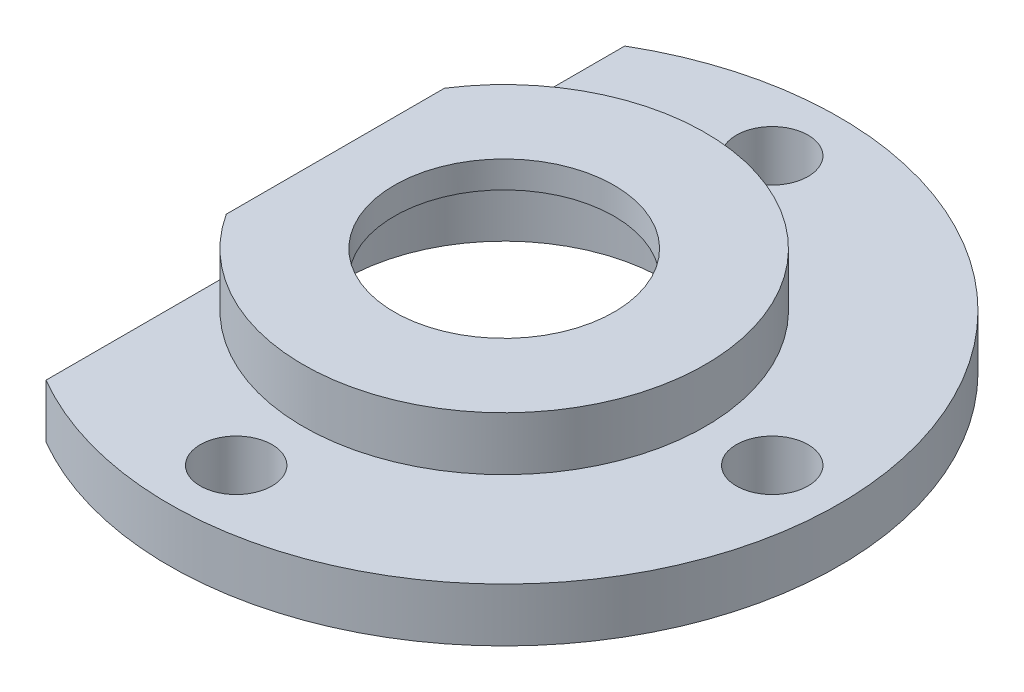
ISO-10303-21;
HEADER;
FILE_DESCRIPTION(('STEP AP214'),'2;1');
FILE_NAME('part.step','',(''),(''),'','','');
FILE_SCHEMA(('AUTOMOTIVE_DESIGN { 1 0 10303 214 1 1 1 1 }'));
ENDSEC;
DATA;
#1=APPLICATION_CONTEXT('core data for automotive mechanical design processes');
#2=APPLICATION_PROTOCOL_DEFINITION('international standard','automotive_design',2000,#1);
#3=PRODUCT_CONTEXT('',#1,'mechanical');
#4=PRODUCT('Part','Part','',(#3));
#5=PRODUCT_RELATED_PRODUCT_CATEGORY('part','',(#4));
#6=PRODUCT_DEFINITION_FORMATION('','',#4);
#7=PRODUCT_DEFINITION_CONTEXT('part definition',#1,'design');
#8=PRODUCT_DEFINITION('design','',#6,#7);
#9=PRODUCT_DEFINITION_SHAPE('','',#8);
#10=(LENGTH_UNIT() NAMED_UNIT(*) SI_UNIT(.MILLI.,.METRE.));
#11=(NAMED_UNIT(*) PLANE_ANGLE_UNIT() SI_UNIT($,.RADIAN.));
#12=(NAMED_UNIT(*) SI_UNIT($,.STERADIAN.) SOLID_ANGLE_UNIT());
#13=UNCERTAINTY_MEASURE_WITH_UNIT(LENGTH_MEASURE(1.E-05),#10,'distance_accuracy_value','');
#14=(GEOMETRIC_REPRESENTATION_CONTEXT(3) GLOBAL_UNCERTAINTY_ASSIGNED_CONTEXT((#13)) GLOBAL_UNIT_ASSIGNED_CONTEXT((#10,
#11,#12)) REPRESENTATION_CONTEXT('',''));
#15=CARTESIAN_POINT('',(0.,0.,0.));
#16=DIRECTION('',(0.,0.,1.));
#17=DIRECTION('',(1.,0.,0.));
#18=AXIS2_PLACEMENT_3D('',#15,#16,#17);
#19=CARTESIAN_POINT('',(0.,2.54,0.));
#20=DIRECTION('',(0.,-1.,0.));
#21=DIRECTION('',(0.,0.,1.));
#22=AXIS2_PLACEMENT_3D('',#19,#20,#21);
#23=CYLINDRICAL_SURFACE('',#22,15.875);
#24=DIRECTION('',(0.,-1.,0.));
#25=VECTOR('',#24,1.);
#26=CARTESIAN_POINT('',(-8.,5.33400000000001,13.7118789740867));
#27=LINE('',#26,#25);
#28=CARTESIAN_POINT('',(-8.,2.54,13.7118789740867));
#29=VERTEX_POINT('',#28);
#30=CARTESIAN_POINT('',(-8.,0.,13.7118789740867));
#31=VERTEX_POINT('',#30);
#32=EDGE_CURVE('E83',#29,#31,#27,.T.);
#33=ORIENTED_EDGE('',*,*,#32,.T.);
#34=CARTESIAN_POINT('',(0.,0.,0.));
#35=DIRECTION('',(0.,-1.,0.));
#36=DIRECTION('',(0.,0.,-1.));
#37=AXIS2_PLACEMENT_3D('',#34,#35,#36);
#38=CIRCLE('',#37,15.875);
#39=CARTESIAN_POINT('',(-8.,0.,-13.7118789740867));
#40=VERTEX_POINT('',#39);
#41=EDGE_CURVE('E89',#40,#31,#38,.T.);
#42=ORIENTED_EDGE('',*,*,#41,.F.);
#43=DIRECTION('',(0.,-1.,0.));
#44=VECTOR('',#43,1.);
#45=CARTESIAN_POINT('',(-8.,5.33400000000001,-13.7118789740867));
#46=LINE('',#45,#44);
#47=CARTESIAN_POINT('',(-8.,2.54,-13.7118789740867));
#48=VERTEX_POINT('',#47);
#49=EDGE_CURVE('E85',#48,#40,#46,.T.);
#50=ORIENTED_EDGE('',*,*,#49,.F.);
#51=CARTESIAN_POINT('',(0.,2.54,0.));
#52=DIRECTION('',(0.,-1.,0.));
#53=DIRECTION('',(0.,0.,-1.));
#54=AXIS2_PLACEMENT_3D('',#51,#52,#53);
#55=CIRCLE('',#54,15.875);
#56=EDGE_CURVE('E92',#48,#29,#55,.T.);
#57=ORIENTED_EDGE('',*,*,#56,.T.);
#58=EDGE_LOOP('',(#33,#42,#50,#57));
#59=FACE_BOUND('',#58,.T.);
#60=ADVANCED_FACE('F41',(#59),#23,.T.);
#61=CARTESIAN_POINT('',(0.,2.54,0.));
#62=DIRECTION('',(0.,1.,0.));
#63=DIRECTION('',(0.,0.,-1.));
#64=AXIS2_PLACEMENT_3D('',#61,#62,#63);
#65=PLANE('',#64);
#66=CARTESIAN_POINT('',(0.,2.54,-12.7));
#67=DIRECTION('',(0.,-1.,0.));
#68=DIRECTION('',(0.,0.,-1.));
#69=AXIS2_PLACEMENT_3D('',#66,#67,#68);
#70=CIRCLE('',#69,1.7);
#71=CARTESIAN_POINT('',(0.,2.54,-14.4));
#72=VERTEX_POINT('',#71);
#73=EDGE_CURVE('E117',#72,#72,#70,.T.);
#74=ORIENTED_EDGE('',*,*,#73,.T.);
#75=EDGE_LOOP('',(#74));
#76=FACE_BOUND('',#75,.T.);
#77=CARTESIAN_POINT('',(12.7,2.54,0.));
#78=DIRECTION('',(0.,-1.,0.));
#79=DIRECTION('',(0.,0.,-1.));
#80=AXIS2_PLACEMENT_3D('',#77,#78,#79);
#81=CIRCLE('',#80,1.70000000000004);
#82=CARTESIAN_POINT('',(12.7,2.54,-1.70000000000004));
#83=VERTEX_POINT('',#82);
#84=EDGE_CURVE('E110',#83,#83,#81,.T.);
#85=ORIENTED_EDGE('',*,*,#84,.T.);
#86=EDGE_LOOP('',(#85));
#87=FACE_BOUND('',#86,.T.);
#88=CARTESIAN_POINT('',(0.,2.54,12.7));
#89=DIRECTION('',(0.,-1.,0.));
#90=DIRECTION('',(0.,0.,-1.));
#91=AXIS2_PLACEMENT_3D('',#88,#89,#90);
#92=CIRCLE('',#91,1.7);
#93=CARTESIAN_POINT('',(0.,2.54,11.));
#94=VERTEX_POINT('',#93);
#95=EDGE_CURVE('E106',#94,#94,#92,.T.);
#96=ORIENTED_EDGE('',*,*,#95,.T.);
#97=EDGE_LOOP('',(#96));
#98=FACE_BOUND('',#97,.T.);
#99=ORIENTED_EDGE('',*,*,#56,.F.);
#100=DIRECTION('',(0.,0.,-1.));
#101=VECTOR('',#100,1.);
#102=CARTESIAN_POINT('',(-8.,2.54,0.));
#103=LINE('',#102,#101);
#104=CARTESIAN_POINT('',(-8.,2.54,-5.16968325915621));
#105=VERTEX_POINT('',#104);
#106=EDGE_CURVE('E103',#105,#48,#103,.T.);
#107=ORIENTED_EDGE('',*,*,#106,.F.);
#108=CARTESIAN_POINT('',(0.,2.54,0.));
#109=DIRECTION('',(0.,-1.,0.));
#110=DIRECTION('',(0.,0.,-1.));
#111=AXIS2_PLACEMENT_3D('',#108,#109,#110);
#112=CIRCLE('',#111,9.525);
#113=CARTESIAN_POINT('',(-8.,2.54,5.16968325915621));
#114=VERTEX_POINT('',#113);
#115=EDGE_CURVE('E48',#105,#114,#112,.T.);
#116=ORIENTED_EDGE('',*,*,#115,.T.);
#117=EDGE_CURVE('E105',#29,#114,#103,.T.);
#118=ORIENTED_EDGE('',*,*,#117,.F.);
#119=EDGE_LOOP('',(#99,#107,#116,#118));
#120=FACE_BOUND('',#119,.T.);
#121=ADVANCED_FACE('F141',(#76,#87,#98,#120),#65,.T.);
#122=CARTESIAN_POINT('',(0.,0.,0.));
#123=DIRECTION('',(0.,1.,0.));
#124=DIRECTION('',(0.,0.,-1.));
#125=AXIS2_PLACEMENT_3D('',#122,#123,#124);
#126=PLANE('',#125);
#127=CARTESIAN_POINT('',(0.,0.,0.));
#128=DIRECTION('',(0.,1.,0.));
#129=DIRECTION('',(0.,0.,1.));
#130=AXIS2_PLACEMENT_3D('',#127,#128,#129);
#131=CIRCLE('',#130,7.62);
#132=CARTESIAN_POINT('',(0.,0.,7.62));
#133=VERTEX_POINT('',#132);
#134=EDGE_CURVE('E128',#133,#133,#131,.T.);
#135=ORIENTED_EDGE('',*,*,#134,.T.);
#136=EDGE_LOOP('',(#135));
#137=FACE_BOUND('',#136,.T.);
#138=CARTESIAN_POINT('',(0.,0.,-12.7));
#139=DIRECTION('',(0.,-1.,0.));
#140=DIRECTION('',(0.,0.,-1.));
#141=AXIS2_PLACEMENT_3D('',#138,#139,#140);
#142=CIRCLE('',#141,1.7);
#143=CARTESIAN_POINT('',(0.,0.,-14.4));
#144=VERTEX_POINT('',#143);
#145=EDGE_CURVE('E120',#144,#144,#142,.F.);
#146=ORIENTED_EDGE('',*,*,#145,.T.);
#147=EDGE_LOOP('',(#146));
#148=FACE_BOUND('',#147,.T.);
#149=CARTESIAN_POINT('',(12.7,0.,0.));
#150=DIRECTION('',(0.,-1.,0.));
#151=DIRECTION('',(0.,0.,-1.));
#152=AXIS2_PLACEMENT_3D('',#149,#150,#151);
#153=CIRCLE('',#152,1.70000000000004);
#154=CARTESIAN_POINT('',(12.7,0.,-1.70000000000004));
#155=VERTEX_POINT('',#154);
#156=EDGE_CURVE('E114',#155,#155,#153,.F.);
#157=ORIENTED_EDGE('',*,*,#156,.T.);
#158=EDGE_LOOP('',(#157));
#159=FACE_BOUND('',#158,.T.);
#160=CARTESIAN_POINT('',(0.,0.,12.7));
#161=DIRECTION('',(0.,-1.,0.));
#162=DIRECTION('',(0.,0.,-1.));
#163=AXIS2_PLACEMENT_3D('',#160,#161,#162);
#164=CIRCLE('',#163,1.7);
#165=CARTESIAN_POINT('',(0.,0.,11.));
#166=VERTEX_POINT('',#165);
#167=EDGE_CURVE('E109',#166,#166,#164,.F.);
#168=ORIENTED_EDGE('',*,*,#167,.T.);
#169=EDGE_LOOP('',(#168));
#170=FACE_BOUND('',#169,.T.);
#171=DIRECTION('',(0.,0.,-1.));
#172=VECTOR('',#171,1.);
#173=CARTESIAN_POINT('',(-8.,0.,0.));
#174=LINE('',#173,#172);
#175=EDGE_CURVE('E79',#31,#40,#174,.T.);
#176=ORIENTED_EDGE('',*,*,#175,.T.);
#177=ORIENTED_EDGE('',*,*,#41,.T.);
#178=EDGE_LOOP('',(#176,#177));
#179=FACE_BOUND('',#178,.T.);
#180=ADVANCED_FACE('F90',(#137,#148,#159,#170,#179),#126,.F.);
#181=CARTESIAN_POINT('',(0.,5.08,0.));
#182=DIRECTION('',(0.,-1.,0.));
#183=DIRECTION('',(0.,0.,1.));
#184=AXIS2_PLACEMENT_3D('',#181,#182,#183);
#185=CYLINDRICAL_SURFACE('',#184,9.525);
#186=DIRECTION('',(0.,-1.,0.));
#187=VECTOR('',#186,1.);
#188=CARTESIAN_POINT('',(-8.,5.08,5.16968325915621));
#189=LINE('',#188,#187);
#190=CARTESIAN_POINT('',(-8.,5.08,5.16968325915621));
#191=VERTEX_POINT('',#190);
#192=EDGE_CURVE('E60',#191,#114,#189,.T.);
#193=ORIENTED_EDGE('',*,*,#192,.T.);
#194=ORIENTED_EDGE('',*,*,#115,.F.);
#195=DIRECTION('',(0.,-1.,0.));
#196=VECTOR('',#195,1.);
#197=CARTESIAN_POINT('',(-8.,5.08,-5.16968325915621));
#198=LINE('',#197,#196);
#199=CARTESIAN_POINT('',(-8.,5.08,-5.16968325915621));
#200=VERTEX_POINT('',#199);
#201=EDGE_CURVE('E96',#105,#200,#198,.F.);
#202=ORIENTED_EDGE('',*,*,#201,.T.);
#203=CARTESIAN_POINT('',(0.,5.08,0.));
#204=DIRECTION('',(0.,-1.,0.));
#205=DIRECTION('',(0.,0.,-1.));
#206=AXIS2_PLACEMENT_3D('',#203,#204,#205);
#207=CIRCLE('',#206,9.525);
#208=EDGE_CURVE('E93',#200,#191,#207,.T.);
#209=ORIENTED_EDGE('',*,*,#208,.T.);
#210=EDGE_LOOP('',(#193,#194,#202,#209));
#211=FACE_BOUND('',#210,.T.);
#212=ADVANCED_FACE('F142',(#211),#185,.T.);
#213=CARTESIAN_POINT('',(0.,5.08,0.));
#214=DIRECTION('',(0.,1.,0.));
#215=DIRECTION('',(0.,0.,-1.));
#216=AXIS2_PLACEMENT_3D('',#213,#214,#215);
#217=PLANE('',#216);
#218=CARTESIAN_POINT('',(0.,5.08,0.));
#219=DIRECTION('',(0.,-1.,0.));
#220=DIRECTION('',(0.,0.,-1.));
#221=AXIS2_PLACEMENT_3D('',#218,#219,#220);
#222=CIRCLE('',#221,5.207);
#223=CARTESIAN_POINT('',(0.,5.08,-5.207));
#224=VERTEX_POINT('',#223);
#225=EDGE_CURVE('E125',#224,#224,#222,.T.);
#226=ORIENTED_EDGE('',*,*,#225,.T.);
#227=EDGE_LOOP('',(#226));
#228=FACE_BOUND('',#227,.T.);
#229=ORIENTED_EDGE('',*,*,#208,.F.);
#230=DIRECTION('',(0.,0.,-1.));
#231=VECTOR('',#230,1.);
#232=CARTESIAN_POINT('',(-8.,5.08,0.));
#233=LINE('',#232,#231);
#234=EDGE_CURVE('E11',#191,#200,#233,.T.);
#235=ORIENTED_EDGE('',*,*,#234,.F.);
#236=EDGE_LOOP('',(#229,#235));
#237=FACE_BOUND('',#236,.T.);
#238=ADVANCED_FACE('F144',(#228,#237),#217,.T.);
#239=CARTESIAN_POINT('',(0.,3.81,0.));
#240=DIRECTION('',(0.,-1.,0.));
#241=DIRECTION('',(0.,0.,1.));
#242=AXIS2_PLACEMENT_3D('',#239,#240,#241);
#243=CYLINDRICAL_SURFACE('',#242,7.62);
#244=CARTESIAN_POINT('',(0.,3.81,0.));
#245=DIRECTION('',(0.,1.,0.));
#246=DIRECTION('',(0.,0.,1.));
#247=AXIS2_PLACEMENT_3D('',#244,#245,#246);
#248=CIRCLE('',#247,7.62);
#249=CARTESIAN_POINT('',(0.,3.81,7.62));
#250=VERTEX_POINT('',#249);
#251=EDGE_CURVE('E131',#250,#250,#248,.T.);
#252=CARTESIAN_POINT('',(0.,3.81,7.62));
#253=CARTESIAN_POINT('',(0.,3.7703125,7.62));
#254=CARTESIAN_POINT('',(0.,3.730625,7.62));
#255=CARTESIAN_POINT('',(0.,3.65125,7.62));
#256=CARTESIAN_POINT('',(0.,3.6115625,7.62));
#257=CARTESIAN_POINT('',(0.,3.5321875,7.62));
#258=CARTESIAN_POINT('',(0.,3.4925,7.62));
#259=CARTESIAN_POINT('',(0.,3.413125,7.62));
#260=CARTESIAN_POINT('',(0.,3.3734375,7.62));
#261=CARTESIAN_POINT('',(0.,3.2940625,7.62));
#262=CARTESIAN_POINT('',(0.,3.254375,7.62));
#263=CARTESIAN_POINT('',(0.,3.175,7.62));
#264=CARTESIAN_POINT('',(0.,3.1353125,7.62));
#265=CARTESIAN_POINT('',(0.,3.0559375,7.62));
#266=CARTESIAN_POINT('',(0.,3.01625,7.62));
#267=CARTESIAN_POINT('',(0.,2.936875,7.62));
#268=CARTESIAN_POINT('',(0.,2.8971875,7.62));
#269=CARTESIAN_POINT('',(0.,2.8178125,7.62));
#270=CARTESIAN_POINT('',(0.,2.778125,7.62));
#271=CARTESIAN_POINT('',(0.,2.69875,7.62));
#272=CARTESIAN_POINT('',(0.,2.6590625,7.62));
#273=CARTESIAN_POINT('',(0.,2.5796875,7.62));
#274=CARTESIAN_POINT('',(0.,2.54,7.62));
#275=CARTESIAN_POINT('',(0.,2.460625,7.62));
#276=CARTESIAN_POINT('',(0.,2.4209375,7.62));
#277=CARTESIAN_POINT('',(0.,2.3415625,7.62));
#278=CARTESIAN_POINT('',(0.,2.301875,7.62));
#279=CARTESIAN_POINT('',(0.,2.2225,7.62));
#280=CARTESIAN_POINT('',(0.,2.1828125,7.62));
#281=CARTESIAN_POINT('',(0.,2.1034375,7.62));
#282=CARTESIAN_POINT('',(0.,2.06375,7.62));
#283=CARTESIAN_POINT('',(0.,1.984375,7.62));
#284=CARTESIAN_POINT('',(0.,1.9446875,7.62));
#285=CARTESIAN_POINT('',(0.,1.8653125,7.62));
#286=CARTESIAN_POINT('',(0.,1.825625,7.62));
#287=CARTESIAN_POINT('',(0.,1.74625,7.62));
#288=CARTESIAN_POINT('',(0.,1.7065625,7.62));
#289=CARTESIAN_POINT('',(0.,1.6271875,7.62));
#290=CARTESIAN_POINT('',(0.,1.5875,7.62));
#291=CARTESIAN_POINT('',(0.,1.508125,7.62));
#292=CARTESIAN_POINT('',(0.,1.4684375,7.62));
#293=CARTESIAN_POINT('',(0.,1.3890625,7.62));
#294=CARTESIAN_POINT('',(0.,1.349375,7.62));
#295=CARTESIAN_POINT('',(0.,1.27,7.62));
#296=CARTESIAN_POINT('',(0.,1.2303125,7.62));
#297=CARTESIAN_POINT('',(0.,1.1509375,7.62));
#298=CARTESIAN_POINT('',(0.,1.11125,7.62));
#299=CARTESIAN_POINT('',(0.,1.031875,7.62));
#300=CARTESIAN_POINT('',(0.,0.9921875,7.62));
#301=CARTESIAN_POINT('',(0.,0.9128125,7.62));
#302=CARTESIAN_POINT('',(0.,0.873125,7.62));
#303=CARTESIAN_POINT('',(0.,0.79375,7.62));
#304=CARTESIAN_POINT('',(0.,0.7540625,7.62));
#305=CARTESIAN_POINT('',(0.,0.6746875,7.62));
#306=CARTESIAN_POINT('',(0.,0.635,7.62));
#307=CARTESIAN_POINT('',(0.,0.555625,7.62));
#308=CARTESIAN_POINT('',(0.,0.5159375,7.62));
#309=CARTESIAN_POINT('',(0.,0.4365625,7.62));
#310=CARTESIAN_POINT('',(0.,0.396875,7.62));
#311=CARTESIAN_POINT('',(0.,0.3175,7.62));
#312=CARTESIAN_POINT('',(0.,0.2778125,7.62));
#313=CARTESIAN_POINT('',(0.,0.1984375,7.62));
#314=CARTESIAN_POINT('',(0.,0.15875,7.62));
#315=CARTESIAN_POINT('',(0.,0.0793749999999999,7.62));
#316=CARTESIAN_POINT('',(0.,0.0396874999999999,7.62));
#317=CARTESIAN_POINT('',(0.,0.,7.62));
#318=B_SPLINE_CURVE_WITH_KNOTS('',3,(#252,#253,#254,#255,#256,#257,#258,#259,#260,#261,#262,
#263,#264,#265,#266,#267,#268,#269,#270,#271,#272,#273,#274,#275,#276,#277,#278,#279,#280,#281,
#282,#283,#284,#285,#286,#287,#288,#289,#290,#291,#292,#293,#294,#295,#296,#297,#298,#299,#300,
#301,#302,#303,#304,#305,#306,#307,#308,#309,#310,#311,#312,#313,#314,#315,#316,#317),
.UNSPECIFIED.,.F.,.F.,(4,2,2,2,2,2,2,2,2,2,2,2,2,2,2,2,2,2,2,2,2,2,2,2,2,2,2,2,2,2,2,2,4),(0.,
0.1190625,0.238125,0.3571875,0.47625,0.5953125,0.714375,0.8334375,0.9525,1.0715625,1.190625,
1.3096875,1.42875,1.5478125,1.666875,1.7859375,1.905,2.0240625,2.143125,2.2621875,2.38125,
2.5003125,2.619375,2.7384375,2.8575,2.9765625,3.095625,3.2146875,3.33375,3.4528125,3.571875,
3.6909375,3.81),.UNSPECIFIED.);
#319=EDGE_CURVE('BSEAM146',#250,#133,#318,.T.);
#320=ORIENTED_EDGE('',*,*,#251,.T.);
#321=ORIENTED_EDGE('',*,*,#134,.F.);
#322=ORIENTED_EDGE('',*,*,#319,.T.);
#323=ORIENTED_EDGE('',*,*,#319,.F.);
#324=EDGE_LOOP('',(#320,#322,#321,#323));
#325=FACE_BOUND('',#324,.T.);
#326=ADVANCED_FACE('F146',(#325),#243,.F.);
#327=CARTESIAN_POINT('',(0.,3.81,0.));
#328=DIRECTION('',(0.,-1.,0.));
#329=DIRECTION('',(0.,0.,1.));
#330=AXIS2_PLACEMENT_3D('',#327,#328,#329);
#331=PLANE('',#330);
#332=CARTESIAN_POINT('',(0.,3.81,0.));
#333=DIRECTION('',(0.,1.,0.));
#334=DIRECTION('',(0.,0.,1.));
#335=AXIS2_PLACEMENT_3D('',#332,#333,#334);
#336=CIRCLE('',#335,5.207);
#337=CARTESIAN_POINT('',(0.,3.81,5.207));
#338=VERTEX_POINT('',#337);
#339=EDGE_CURVE('E113',#338,#338,#336,.F.);
#340=ORIENTED_EDGE('',*,*,#339,.F.);
#341=EDGE_LOOP('',(#340));
#342=FACE_BOUND('',#341,.T.);
#343=ORIENTED_EDGE('',*,*,#251,.F.);
#344=EDGE_LOOP('',(#343));
#345=FACE_BOUND('',#344,.T.);
#346=ADVANCED_FACE('F153',(#342,#345),#331,.T.);
#347=CARTESIAN_POINT('',(0.,-0.00100000000000013,0.));
#348=DIRECTION('',(0.,1.,0.));
#349=DIRECTION('',(0.,0.,-1.));
#350=AXIS2_PLACEMENT_3D('',#347,#348,#349);
#351=CYLINDRICAL_SURFACE('',#350,5.207);
#352=ORIENTED_EDGE('',*,*,#339,.T.);
#353=EDGE_LOOP('',(#352));
#354=FACE_BOUND('',#353,.T.);
#355=ORIENTED_EDGE('',*,*,#225,.F.);
#356=EDGE_LOOP('',(#355));
#357=FACE_BOUND('',#356,.T.);
#358=ADVANCED_FACE('F191',(#354,#357),#351,.F.);
#359=CARTESIAN_POINT('',(0.,-0.00100000000000013,-12.7));
#360=DIRECTION('',(0.,1.,0.));
#361=DIRECTION('',(0.,0.,-1.));
#362=AXIS2_PLACEMENT_3D('',#359,#360,#361);
#363=CYLINDRICAL_SURFACE('',#362,1.7);
#364=ORIENTED_EDGE('',*,*,#73,.F.);
#365=EDGE_LOOP('',(#364));
#366=FACE_BOUND('',#365,.T.);
#367=ORIENTED_EDGE('',*,*,#145,.F.);
#368=EDGE_LOOP('',(#367));
#369=FACE_BOUND('',#368,.T.);
#370=ADVANCED_FACE('F185',(#366,#369),#363,.F.);
#371=CARTESIAN_POINT('',(12.7,-0.00100000000000013,0.));
#372=DIRECTION('',(0.,1.,0.));
#373=DIRECTION('',(0.,0.,-1.));
#374=AXIS2_PLACEMENT_3D('',#371,#372,#373);
#375=CYLINDRICAL_SURFACE('',#374,1.70000000000004);
#376=ORIENTED_EDGE('',*,*,#84,.F.);
#377=EDGE_LOOP('',(#376));
#378=FACE_BOUND('',#377,.T.);
#379=ORIENTED_EDGE('',*,*,#156,.F.);
#380=EDGE_LOOP('',(#379));
#381=FACE_BOUND('',#380,.T.);
#382=ADVANCED_FACE('F176',(#378,#381),#375,.F.);
#383=CARTESIAN_POINT('',(0.,-0.00100000000000013,12.7));
#384=DIRECTION('',(0.,1.,0.));
#385=DIRECTION('',(0.,0.,-1.));
#386=AXIS2_PLACEMENT_3D('',#383,#384,#385);
#387=CYLINDRICAL_SURFACE('',#386,1.7);
#388=ORIENTED_EDGE('',*,*,#95,.F.);
#389=EDGE_LOOP('',(#388));
#390=FACE_BOUND('',#389,.T.);
#391=ORIENTED_EDGE('',*,*,#167,.F.);
#392=EDGE_LOOP('',(#391));
#393=FACE_BOUND('',#392,.T.);
#394=ADVANCED_FACE('F173',(#390,#393),#387,.F.);
#395=CARTESIAN_POINT('',(-8.,5.33400000000001,0.));
#396=DIRECTION('',(-1.,0.,0.));
#397=DIRECTION('',(0.,0.,-1.));
#398=AXIS2_PLACEMENT_3D('',#395,#396,#397);
#399=PLANE('',#398);
#400=ORIENTED_EDGE('',*,*,#32,.F.);
#401=ORIENTED_EDGE('',*,*,#117,.T.);
#402=ORIENTED_EDGE('',*,*,#192,.F.);
#403=ORIENTED_EDGE('',*,*,#234,.T.);
#404=ORIENTED_EDGE('',*,*,#201,.F.);
#405=ORIENTED_EDGE('',*,*,#106,.T.);
#406=ORIENTED_EDGE('',*,*,#49,.T.);
#407=ORIENTED_EDGE('',*,*,#175,.F.);
#408=EDGE_LOOP('',(#400,#401,#402,#403,#404,#405,#406,#407));
#409=FACE_BOUND('',#408,.T.);
#410=ADVANCED_FACE('F81',(#409),#399,.T.);
#411=CLOSED_SHELL('',(#60,#121,#180,#212,#238,#326,#346,#358,#370,#382,#394,#410));
#412=MANIFOLD_SOLID_BREP('B2',#411);
#413=ADVANCED_BREP_SHAPE_REPRESENTATION('',(#18,#412),#14);
#414=SHAPE_DEFINITION_REPRESENTATION(#9,#413);
ENDSEC;
END-ISO-10303-21;
